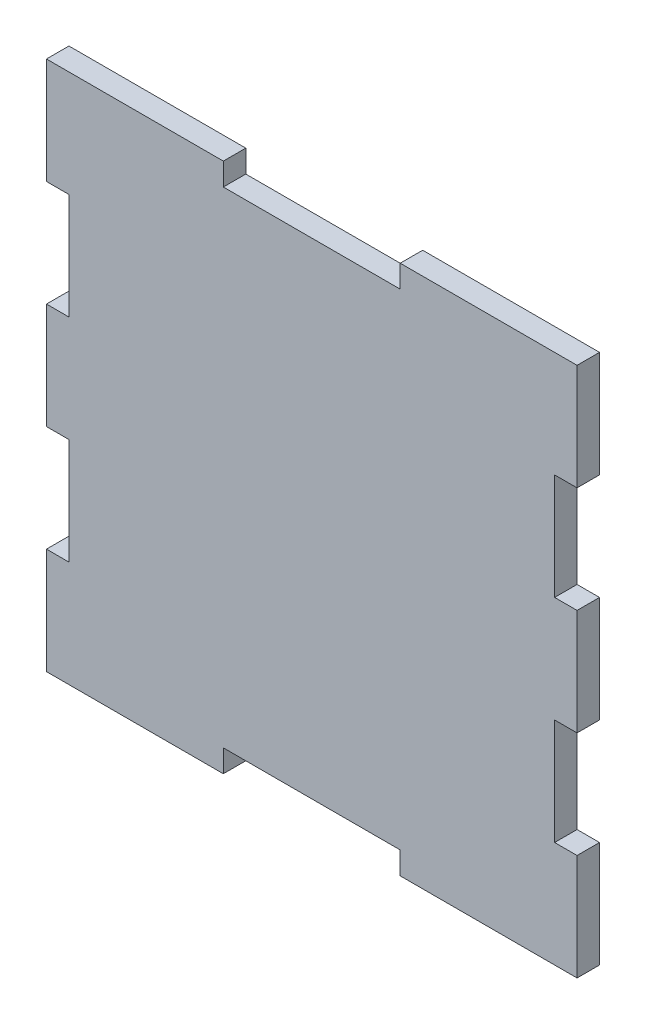
ISO-10303-21;
HEADER;
FILE_DESCRIPTION(('STEP AP214'),'2;1');
FILE_NAME('part.step','',(''),(''),'','','');
FILE_SCHEMA(('AUTOMOTIVE_DESIGN { 1 0 10303 214 1 1 1 1 }'));
ENDSEC;
DATA;
#1=APPLICATION_CONTEXT('core data for automotive mechanical design processes');
#2=APPLICATION_PROTOCOL_DEFINITION('international standard','automotive_design',2000,#1);
#3=PRODUCT_CONTEXT('',#1,'mechanical');
#4=PRODUCT('Part','Part','',(#3));
#5=PRODUCT_RELATED_PRODUCT_CATEGORY('part','',(#4));
#6=PRODUCT_DEFINITION_FORMATION('','',#4);
#7=PRODUCT_DEFINITION_CONTEXT('part definition',#1,'design');
#8=PRODUCT_DEFINITION('design','',#6,#7);
#9=PRODUCT_DEFINITION_SHAPE('','',#8);
#10=(LENGTH_UNIT() NAMED_UNIT(*) SI_UNIT(.MILLI.,.METRE.));
#11=(NAMED_UNIT(*) PLANE_ANGLE_UNIT() SI_UNIT($,.RADIAN.));
#12=(NAMED_UNIT(*) SI_UNIT($,.STERADIAN.) SOLID_ANGLE_UNIT());
#13=UNCERTAINTY_MEASURE_WITH_UNIT(LENGTH_MEASURE(1.E-05),#10,'distance_accuracy_value','');
#14=(GEOMETRIC_REPRESENTATION_CONTEXT(3) GLOBAL_UNCERTAINTY_ASSIGNED_CONTEXT((#13)) GLOBAL_UNIT_ASSIGNED_CONTEXT((#10,
#11,#12)) REPRESENTATION_CONTEXT('',''));
#15=CARTESIAN_POINT('',(0.,0.,0.));
#16=DIRECTION('',(0.,0.,1.));
#17=DIRECTION('',(1.,0.,0.));
#18=AXIS2_PLACEMENT_3D('',#15,#16,#17);
#19=CARTESIAN_POINT('',(-7.20562390158188,187.891798144197,6.35));
#20=DIRECTION('',(0.,-1.,0.));
#21=DIRECTION('',(1.,0.,0.));
#22=AXIS2_PLACEMENT_3D('',#19,#20,#21);
#23=PLANE('',#22);
#24=DIRECTION('',(-1.,0.,0.));
#25=VECTOR('',#24,1.);
#26=CARTESIAN_POINT('',(-7.20562390158188,187.891798144197,0.));
#27=LINE('',#26,#25);
#28=CARTESIAN_POINT('',(42.7943760984181,187.891798144198,0.));
#29=VERTEX_POINT('',#28);
#30=CARTESIAN_POINT('',(-7.20562390158188,187.891798144197,0.));
#31=VERTEX_POINT('',#30);
#32=EDGE_CURVE('E249',#29,#31,#27,.T.);
#33=ORIENTED_EDGE('',*,*,#32,.T.);
#34=DIRECTION('',(0.,0.,-1.));
#35=VECTOR('',#34,1.);
#36=CARTESIAN_POINT('',(-7.20562390158188,187.891798144197,6.35));
#37=LINE('',#36,#35);
#38=CARTESIAN_POINT('',(-7.20562390158188,187.891798144197,6.35));
#39=VERTEX_POINT('',#38);
#40=EDGE_CURVE('E11',#39,#31,#37,.T.);
#41=ORIENTED_EDGE('',*,*,#40,.F.);
#42=DIRECTION('',(-1.,0.,0.));
#43=VECTOR('',#42,1.);
#44=CARTESIAN_POINT('',(-7.20562390158188,187.891798144197,6.35));
#45=LINE('',#44,#43);
#46=CARTESIAN_POINT('',(42.7943760984181,187.891798144198,6.35));
#47=VERTEX_POINT('',#46);
#48=EDGE_CURVE('E303',#47,#39,#45,.T.);
#49=ORIENTED_EDGE('',*,*,#48,.F.);
#50=DIRECTION('',(0.,0.,-1.));
#51=VECTOR('',#50,1.);
#52=CARTESIAN_POINT('',(42.7943760984181,187.891798144198,6.35));
#53=LINE('',#52,#51);
#54=EDGE_CURVE('E245',#47,#29,#53,.T.);
#55=ORIENTED_EDGE('',*,*,#54,.T.);
#56=EDGE_LOOP('',(#33,#41,#49,#55));
#57=FACE_BOUND('',#56,.T.);
#58=ADVANCED_FACE('F33',(#57),#23,.F.);
#59=CARTESIAN_POINT('',(-7.20562390158188,187.891798144197,6.35));
#60=DIRECTION('',(1.,0.,0.));
#61=DIRECTION('',(0.,1.,0.));
#62=AXIS2_PLACEMENT_3D('',#59,#60,#61);
#63=PLANE('',#62);
#64=DIRECTION('',(0.,-1.,0.));
#65=VECTOR('',#64,1.);
#66=CARTESIAN_POINT('',(-7.20562390158188,187.891798144197,0.));
#67=LINE('',#66,#65);
#68=CARTESIAN_POINT('',(-7.20562390158181,157.891798144197,0.));
#69=VERTEX_POINT('',#68);
#70=EDGE_CURVE('E252',#31,#69,#67,.T.);
#71=ORIENTED_EDGE('',*,*,#70,.T.);
#72=DIRECTION('',(0.,0.,-1.));
#73=VECTOR('',#72,1.);
#74=CARTESIAN_POINT('',(-7.20562390158181,157.891798144197,6.35));
#75=LINE('',#74,#73);
#76=CARTESIAN_POINT('',(-7.20562390158181,157.891798144197,6.35));
#77=VERTEX_POINT('',#76);
#78=EDGE_CURVE('E41',#77,#69,#75,.T.);
#79=ORIENTED_EDGE('',*,*,#78,.F.);
#80=DIRECTION('',(0.,-1.,0.));
#81=VECTOR('',#80,1.);
#82=CARTESIAN_POINT('',(-7.20562390158188,187.891798144197,6.35));
#83=LINE('',#82,#81);
#84=EDGE_CURVE('E152',#39,#77,#83,.T.);
#85=ORIENTED_EDGE('',*,*,#84,.F.);
#86=ORIENTED_EDGE('',*,*,#40,.T.);
#87=EDGE_LOOP('',(#71,#79,#85,#86));
#88=FACE_BOUND('',#87,.T.);
#89=ADVANCED_FACE('F461',(#88),#63,.F.);
#90=CARTESIAN_POINT('',(-7.20562390158181,157.891798144197,6.35));
#91=DIRECTION('',(0.,1.,0.));
#92=DIRECTION('',(-1.,0.,0.));
#93=AXIS2_PLACEMENT_3D('',#90,#91,#92);
#94=PLANE('',#93);
#95=DIRECTION('',(1.,0.,0.));
#96=VECTOR('',#95,1.);
#97=CARTESIAN_POINT('',(-7.20562390158181,157.891798144197,0.));
#98=LINE('',#97,#96);
#99=CARTESIAN_POINT('',(-0.855623901581808,157.891798144197,0.));
#100=VERTEX_POINT('',#99);
#101=EDGE_CURVE('E254',#69,#100,#98,.T.);
#102=ORIENTED_EDGE('',*,*,#101,.T.);
#103=DIRECTION('',(0.,0.,-1.));
#104=VECTOR('',#103,1.);
#105=CARTESIAN_POINT('',(-0.855623901581808,157.891798144197,6.35));
#106=LINE('',#105,#104);
#107=CARTESIAN_POINT('',(-0.855623901581808,157.891798144197,6.35));
#108=VERTEX_POINT('',#107);
#109=EDGE_CURVE('E370',#108,#100,#106,.T.);
#110=ORIENTED_EDGE('',*,*,#109,.F.);
#111=DIRECTION('',(1.,0.,0.));
#112=VECTOR('',#111,1.);
#113=CARTESIAN_POINT('',(-7.20562390158181,157.891798144197,6.35));
#114=LINE('',#113,#112);
#115=EDGE_CURVE('E378',#77,#108,#114,.T.);
#116=ORIENTED_EDGE('',*,*,#115,.F.);
#117=ORIENTED_EDGE('',*,*,#78,.T.);
#118=EDGE_LOOP('',(#102,#110,#116,#117));
#119=FACE_BOUND('',#118,.T.);
#120=ADVANCED_FACE('F376',(#119),#94,.F.);
#121=CARTESIAN_POINT('',(-0.855623901581808,157.891798144197,6.35));
#122=DIRECTION('',(1.,0.,0.));
#123=DIRECTION('',(0.,1.,0.));
#124=AXIS2_PLACEMENT_3D('',#121,#122,#123);
#125=PLANE('',#124);
#126=DIRECTION('',(0.,-1.,0.));
#127=VECTOR('',#126,1.);
#128=CARTESIAN_POINT('',(-0.855623901581808,157.891798144197,0.));
#129=LINE('',#128,#127);
#130=CARTESIAN_POINT('',(-0.855623901581805,127.891798144197,0.));
#131=VERTEX_POINT('',#130);
#132=EDGE_CURVE('E256',#100,#131,#129,.T.);
#133=ORIENTED_EDGE('',*,*,#132,.T.);
#134=DIRECTION('',(0.,0.,-1.));
#135=VECTOR('',#134,1.);
#136=CARTESIAN_POINT('',(-0.855623901581805,127.891798144197,6.35));
#137=LINE('',#136,#135);
#138=CARTESIAN_POINT('',(-0.855623901581805,127.891798144197,6.35));
#139=VERTEX_POINT('',#138);
#140=EDGE_CURVE('E367',#139,#131,#137,.T.);
#141=ORIENTED_EDGE('',*,*,#140,.F.);
#142=DIRECTION('',(0.,-1.,0.));
#143=VECTOR('',#142,1.);
#144=CARTESIAN_POINT('',(-0.855623901581808,157.891798144197,6.35));
#145=LINE('',#144,#143);
#146=EDGE_CURVE('E396',#108,#139,#145,.T.);
#147=ORIENTED_EDGE('',*,*,#146,.F.);
#148=ORIENTED_EDGE('',*,*,#109,.T.);
#149=EDGE_LOOP('',(#133,#141,#147,#148));
#150=FACE_BOUND('',#149,.T.);
#151=ADVANCED_FACE('F387',(#150),#125,.F.);
#152=CARTESIAN_POINT('',(-0.855623901581805,127.891798144197,6.35));
#153=DIRECTION('',(0.,-1.,0.));
#154=DIRECTION('',(1.,0.,0.));
#155=AXIS2_PLACEMENT_3D('',#152,#153,#154);
#156=PLANE('',#155);
#157=DIRECTION('',(-1.,0.,0.));
#158=VECTOR('',#157,1.);
#159=CARTESIAN_POINT('',(-0.855623901581805,127.891798144197,0.));
#160=LINE('',#159,#158);
#161=CARTESIAN_POINT('',(-7.2056239015818,127.891798144197,0.));
#162=VERTEX_POINT('',#161);
#163=EDGE_CURVE('E258',#131,#162,#160,.T.);
#164=ORIENTED_EDGE('',*,*,#163,.T.);
#165=DIRECTION('',(0.,0.,-1.));
#166=VECTOR('',#165,1.);
#167=CARTESIAN_POINT('',(-7.2056239015818,127.891798144197,6.35));
#168=LINE('',#167,#166);
#169=CARTESIAN_POINT('',(-7.2056239015818,127.891798144197,6.35));
#170=VERTEX_POINT('',#169);
#171=EDGE_CURVE('E364',#170,#162,#168,.T.);
#172=ORIENTED_EDGE('',*,*,#171,.F.);
#173=DIRECTION('',(-1.,0.,0.));
#174=VECTOR('',#173,1.);
#175=CARTESIAN_POINT('',(-0.855623901581805,127.891798144197,6.35));
#176=LINE('',#175,#174);
#177=EDGE_CURVE('E393',#139,#170,#176,.T.);
#178=ORIENTED_EDGE('',*,*,#177,.F.);
#179=ORIENTED_EDGE('',*,*,#140,.T.);
#180=EDGE_LOOP('',(#164,#172,#178,#179));
#181=FACE_BOUND('',#180,.T.);
#182=ADVANCED_FACE('F391',(#181),#156,.F.);
#183=CARTESIAN_POINT('',(-7.2056239015818,127.891798144197,6.35));
#184=DIRECTION('',(1.,0.,0.));
#185=DIRECTION('',(0.,1.,0.));
#186=AXIS2_PLACEMENT_3D('',#183,#184,#185);
#187=PLANE('',#186);
#188=DIRECTION('',(0.,-1.,0.));
#189=VECTOR('',#188,1.);
#190=CARTESIAN_POINT('',(-7.2056239015818,127.891798144197,0.));
#191=LINE('',#190,#189);
#192=CARTESIAN_POINT('',(-7.20562390158172,97.8917981441975,0.));
#193=VERTEX_POINT('',#192);
#194=EDGE_CURVE('E260',#162,#193,#191,.T.);
#195=ORIENTED_EDGE('',*,*,#194,.T.);
#196=DIRECTION('',(0.,0.,-1.));
#197=VECTOR('',#196,1.);
#198=CARTESIAN_POINT('',(-7.20562390158172,97.8917981441975,6.35));
#199=LINE('',#198,#197);
#200=CARTESIAN_POINT('',(-7.20562390158172,97.8917981441975,6.35));
#201=VERTEX_POINT('',#200);
#202=EDGE_CURVE('E361',#201,#193,#199,.T.);
#203=ORIENTED_EDGE('',*,*,#202,.F.);
#204=DIRECTION('',(0.,-1.,0.));
#205=VECTOR('',#204,1.);
#206=CARTESIAN_POINT('',(-7.2056239015818,127.891798144197,6.35));
#207=LINE('',#206,#205);
#208=EDGE_CURVE('E395',#170,#201,#207,.T.);
#209=ORIENTED_EDGE('',*,*,#208,.F.);
#210=ORIENTED_EDGE('',*,*,#171,.T.);
#211=EDGE_LOOP('',(#195,#203,#209,#210));
#212=FACE_BOUND('',#211,.T.);
#213=ADVANCED_FACE('F474',(#212),#187,.F.);
#214=CARTESIAN_POINT('',(-7.20562390158172,97.8917981441975,6.35));
#215=DIRECTION('',(0.,1.,0.));
#216=DIRECTION('',(-1.,0.,0.));
#217=AXIS2_PLACEMENT_3D('',#214,#215,#216);
#218=PLANE('',#217);
#219=DIRECTION('',(1.,0.,0.));
#220=VECTOR('',#219,1.);
#221=CARTESIAN_POINT('',(-7.20562390158172,97.8917981441975,0.));
#222=LINE('',#221,#220);
#223=CARTESIAN_POINT('',(-0.855623901581715,97.8917981441975,0.));
#224=VERTEX_POINT('',#223);
#225=EDGE_CURVE('E262',#193,#224,#222,.T.);
#226=ORIENTED_EDGE('',*,*,#225,.T.);
#227=DIRECTION('',(0.,0.,-1.));
#228=VECTOR('',#227,1.);
#229=CARTESIAN_POINT('',(-0.855623901581715,97.8917981441975,6.35));
#230=LINE('',#229,#228);
#231=CARTESIAN_POINT('',(-0.855623901581715,97.8917981441975,6.35));
#232=VERTEX_POINT('',#231);
#233=EDGE_CURVE('E358',#232,#224,#230,.T.);
#234=ORIENTED_EDGE('',*,*,#233,.F.);
#235=DIRECTION('',(1.,0.,0.));
#236=VECTOR('',#235,1.);
#237=CARTESIAN_POINT('',(-7.20562390158172,97.8917981441975,6.35));
#238=LINE('',#237,#236);
#239=EDGE_CURVE('E398',#201,#232,#238,.T.);
#240=ORIENTED_EDGE('',*,*,#239,.F.);
#241=ORIENTED_EDGE('',*,*,#202,.T.);
#242=EDGE_LOOP('',(#226,#234,#240,#241));
#243=FACE_BOUND('',#242,.T.);
#244=ADVANCED_FACE('F477',(#243),#218,.F.);
#245=CARTESIAN_POINT('',(-0.855623901581715,97.8917981441975,6.35));
#246=DIRECTION('',(1.,0.,0.));
#247=DIRECTION('',(0.,1.,0.));
#248=AXIS2_PLACEMENT_3D('',#245,#246,#247);
#249=PLANE('',#248);
#250=DIRECTION('',(0.,-1.,0.));
#251=VECTOR('',#250,1.);
#252=CARTESIAN_POINT('',(-0.855623901581715,97.8917981441975,0.));
#253=LINE('',#252,#251);
#254=CARTESIAN_POINT('',(-0.855623901581712,67.8917981441975,0.));
#255=VERTEX_POINT('',#254);
#256=EDGE_CURVE('E264',#224,#255,#253,.T.);
#257=ORIENTED_EDGE('',*,*,#256,.T.);
#258=DIRECTION('',(0.,0.,-1.));
#259=VECTOR('',#258,1.);
#260=CARTESIAN_POINT('',(-0.855623901581712,67.8917981441975,6.35));
#261=LINE('',#260,#259);
#262=CARTESIAN_POINT('',(-0.855623901581712,67.8917981441975,6.35));
#263=VERTEX_POINT('',#262);
#264=EDGE_CURVE('E355',#263,#255,#261,.T.);
#265=ORIENTED_EDGE('',*,*,#264,.F.);
#266=DIRECTION('',(0.,-1.,0.));
#267=VECTOR('',#266,1.);
#268=CARTESIAN_POINT('',(-0.855623901581715,97.8917981441975,6.35));
#269=LINE('',#268,#267);
#270=EDGE_CURVE('E404',#232,#263,#269,.T.);
#271=ORIENTED_EDGE('',*,*,#270,.F.);
#272=ORIENTED_EDGE('',*,*,#233,.T.);
#273=EDGE_LOOP('',(#257,#265,#271,#272));
#274=FACE_BOUND('',#273,.T.);
#275=ADVANCED_FACE('F481',(#274),#249,.F.);
#276=CARTESIAN_POINT('',(-0.855623901581712,67.8917981441975,6.35));
#277=DIRECTION('',(0.,-1.,0.));
#278=DIRECTION('',(1.,0.,0.));
#279=AXIS2_PLACEMENT_3D('',#276,#277,#278);
#280=PLANE('',#279);
#281=DIRECTION('',(-1.,0.,0.));
#282=VECTOR('',#281,1.);
#283=CARTESIAN_POINT('',(-0.855623901581712,67.8917981441975,0.));
#284=LINE('',#283,#282);
#285=CARTESIAN_POINT('',(-7.20562390158172,67.8917981441974,0.));
#286=VERTEX_POINT('',#285);
#287=EDGE_CURVE('E266',#255,#286,#284,.T.);
#288=ORIENTED_EDGE('',*,*,#287,.T.);
#289=DIRECTION('',(0.,0.,-1.));
#290=VECTOR('',#289,1.);
#291=CARTESIAN_POINT('',(-7.20562390158172,67.8917981441974,6.35));
#292=LINE('',#291,#290);
#293=CARTESIAN_POINT('',(-7.20562390158172,67.8917981441974,6.35));
#294=VERTEX_POINT('',#293);
#295=EDGE_CURVE('E352',#294,#286,#292,.T.);
#296=ORIENTED_EDGE('',*,*,#295,.F.);
#297=DIRECTION('',(-1.,0.,0.));
#298=VECTOR('',#297,1.);
#299=CARTESIAN_POINT('',(-0.855623901581712,67.8917981441975,6.35));
#300=LINE('',#299,#298);
#301=EDGE_CURVE('E406',#263,#294,#300,.T.);
#302=ORIENTED_EDGE('',*,*,#301,.F.);
#303=ORIENTED_EDGE('',*,*,#264,.T.);
#304=EDGE_LOOP('',(#288,#296,#302,#303));
#305=FACE_BOUND('',#304,.T.);
#306=ADVANCED_FACE('F485',(#305),#280,.F.);
#307=CARTESIAN_POINT('',(-7.20562390158172,67.8917981441974,6.35));
#308=DIRECTION('',(1.,0.,0.));
#309=DIRECTION('',(0.,1.,0.));
#310=AXIS2_PLACEMENT_3D('',#307,#308,#309);
#311=PLANE('',#310);
#312=DIRECTION('',(0.,-1.,0.));
#313=VECTOR('',#312,1.);
#314=CARTESIAN_POINT('',(-7.20562390158172,67.8917981441974,0.));
#315=LINE('',#314,#313);
#316=CARTESIAN_POINT('',(-7.20562390158171,37.8917981441974,0.));
#317=VERTEX_POINT('',#316);
#318=EDGE_CURVE('E268',#286,#317,#315,.T.);
#319=ORIENTED_EDGE('',*,*,#318,.T.);
#320=DIRECTION('',(0.,0.,-1.));
#321=VECTOR('',#320,1.);
#322=CARTESIAN_POINT('',(-7.20562390158171,37.8917981441974,6.35));
#323=LINE('',#322,#321);
#324=CARTESIAN_POINT('',(-7.20562390158171,37.8917981441974,6.35));
#325=VERTEX_POINT('',#324);
#326=EDGE_CURVE('E349',#325,#317,#323,.T.);
#327=ORIENTED_EDGE('',*,*,#326,.F.);
#328=DIRECTION('',(0.,-1.,0.));
#329=VECTOR('',#328,1.);
#330=CARTESIAN_POINT('',(-7.20562390158172,67.8917981441974,6.35));
#331=LINE('',#330,#329);
#332=EDGE_CURVE('E408',#294,#325,#331,.T.);
#333=ORIENTED_EDGE('',*,*,#332,.F.);
#334=ORIENTED_EDGE('',*,*,#295,.T.);
#335=EDGE_LOOP('',(#319,#327,#333,#334));
#336=FACE_BOUND('',#335,.T.);
#337=ADVANCED_FACE('F489',(#336),#311,.F.);
#338=CARTESIAN_POINT('',(-7.20562390158171,37.8917981441974,6.35));
#339=DIRECTION('',(0.,1.,0.));
#340=DIRECTION('',(0.,0.,1.));
#341=AXIS2_PLACEMENT_3D('',#338,#339,#340);
#342=PLANE('',#341);
#343=DIRECTION('',(1.,0.,0.));
#344=VECTOR('',#343,1.);
#345=CARTESIAN_POINT('',(-7.20562390158171,37.8917981441974,0.));
#346=LINE('',#345,#344);
#347=CARTESIAN_POINT('',(42.7943760984182,37.8917981441974,0.));
#348=VERTEX_POINT('',#347);
#349=EDGE_CURVE('E270',#317,#348,#346,.T.);
#350=ORIENTED_EDGE('',*,*,#349,.T.);
#351=DIRECTION('',(0.,0.,-1.));
#352=VECTOR('',#351,1.);
#353=CARTESIAN_POINT('',(42.7943760984182,37.8917981441974,6.35));
#354=LINE('',#353,#352);
#355=CARTESIAN_POINT('',(42.7943760984182,37.8917981441974,6.35));
#356=VERTEX_POINT('',#355);
#357=EDGE_CURVE('E346',#356,#348,#354,.T.);
#358=ORIENTED_EDGE('',*,*,#357,.F.);
#359=DIRECTION('',(1.,0.,0.));
#360=VECTOR('',#359,1.);
#361=CARTESIAN_POINT('',(-7.20562390158171,37.8917981441974,6.35));
#362=LINE('',#361,#360);
#363=EDGE_CURVE('E410',#325,#356,#362,.T.);
#364=ORIENTED_EDGE('',*,*,#363,.F.);
#365=ORIENTED_EDGE('',*,*,#326,.T.);
#366=EDGE_LOOP('',(#350,#358,#364,#365));
#367=FACE_BOUND('',#366,.T.);
#368=ADVANCED_FACE('F493',(#367),#342,.F.);
#369=CARTESIAN_POINT('',(42.7943760984182,37.8917981441974,6.35));
#370=DIRECTION('',(-1.,0.,0.));
#371=DIRECTION('',(0.,0.,1.));
#372=AXIS2_PLACEMENT_3D('',#369,#370,#371);
#373=PLANE('',#372);
#374=DIRECTION('',(0.,1.,0.));
#375=VECTOR('',#374,1.);
#376=CARTESIAN_POINT('',(42.7943760984182,37.8917981441974,0.));
#377=LINE('',#376,#375);
#378=CARTESIAN_POINT('',(42.7943760984182,44.2417981441974,0.));
#379=VERTEX_POINT('',#378);
#380=EDGE_CURVE('E272',#348,#379,#377,.T.);
#381=ORIENTED_EDGE('',*,*,#380,.T.);
#382=DIRECTION('',(0.,0.,-1.));
#383=VECTOR('',#382,1.);
#384=CARTESIAN_POINT('',(42.7943760984182,44.2417981441974,6.35));
#385=LINE('',#384,#383);
#386=CARTESIAN_POINT('',(42.7943760984182,44.2417981441974,6.35));
#387=VERTEX_POINT('',#386);
#388=EDGE_CURVE('E343',#387,#379,#385,.T.);
#389=ORIENTED_EDGE('',*,*,#388,.F.);
#390=DIRECTION('',(0.,1.,0.));
#391=VECTOR('',#390,1.);
#392=CARTESIAN_POINT('',(42.7943760984182,37.8917981441974,6.35));
#393=LINE('',#392,#391);
#394=EDGE_CURVE('E412',#356,#387,#393,.T.);
#395=ORIENTED_EDGE('',*,*,#394,.F.);
#396=ORIENTED_EDGE('',*,*,#357,.T.);
#397=EDGE_LOOP('',(#381,#389,#395,#396));
#398=FACE_BOUND('',#397,.T.);
#399=ADVANCED_FACE('F497',(#398),#373,.F.);
#400=CARTESIAN_POINT('',(42.7943760984182,44.2417981441974,6.35));
#401=DIRECTION('',(0.,1.,0.));
#402=DIRECTION('',(0.,0.,1.));
#403=AXIS2_PLACEMENT_3D('',#400,#401,#402);
#404=PLANE('',#403);
#405=DIRECTION('',(1.,0.,0.));
#406=VECTOR('',#405,1.);
#407=CARTESIAN_POINT('',(42.7943760984182,44.2417981441974,0.));
#408=LINE('',#407,#406);
#409=CARTESIAN_POINT('',(92.7943760984182,44.2417981441974,0.));
#410=VERTEX_POINT('',#409);
#411=EDGE_CURVE('E274',#379,#410,#408,.T.);
#412=ORIENTED_EDGE('',*,*,#411,.T.);
#413=DIRECTION('',(0.,0.,-1.));
#414=VECTOR('',#413,1.);
#415=CARTESIAN_POINT('',(92.7943760984182,44.2417981441974,6.35));
#416=LINE('',#415,#414);
#417=CARTESIAN_POINT('',(92.7943760984182,44.2417981441974,6.35));
#418=VERTEX_POINT('',#417);
#419=EDGE_CURVE('E340',#418,#410,#416,.T.);
#420=ORIENTED_EDGE('',*,*,#419,.F.);
#421=DIRECTION('',(1.,0.,0.));
#422=VECTOR('',#421,1.);
#423=CARTESIAN_POINT('',(42.7943760984182,44.2417981441974,6.35));
#424=LINE('',#423,#422);
#425=EDGE_CURVE('E414',#387,#418,#424,.T.);
#426=ORIENTED_EDGE('',*,*,#425,.F.);
#427=ORIENTED_EDGE('',*,*,#388,.T.);
#428=EDGE_LOOP('',(#412,#420,#426,#427));
#429=FACE_BOUND('',#428,.T.);
#430=ADVANCED_FACE('F501',(#429),#404,.F.);
#431=CARTESIAN_POINT('',(92.7943760984182,44.2417981441974,6.35));
#432=DIRECTION('',(1.,0.,0.));
#433=DIRECTION('',(0.,0.,-1.));
#434=AXIS2_PLACEMENT_3D('',#431,#432,#433);
#435=PLANE('',#434);
#436=DIRECTION('',(0.,-1.,0.));
#437=VECTOR('',#436,1.);
#438=CARTESIAN_POINT('',(92.7943760984182,44.2417981441974,0.));
#439=LINE('',#438,#437);
#440=CARTESIAN_POINT('',(92.7943760984182,37.8917981441974,0.));
#441=VERTEX_POINT('',#440);
#442=EDGE_CURVE('E276',#410,#441,#439,.T.);
#443=ORIENTED_EDGE('',*,*,#442,.T.);
#444=DIRECTION('',(0.,0.,-1.));
#445=VECTOR('',#444,1.);
#446=CARTESIAN_POINT('',(92.7943760984182,37.8917981441974,6.35));
#447=LINE('',#446,#445);
#448=CARTESIAN_POINT('',(92.7943760984182,37.8917981441974,6.35));
#449=VERTEX_POINT('',#448);
#450=EDGE_CURVE('E337',#449,#441,#447,.T.);
#451=ORIENTED_EDGE('',*,*,#450,.F.);
#452=DIRECTION('',(0.,-1.,0.));
#453=VECTOR('',#452,1.);
#454=CARTESIAN_POINT('',(92.7943760984182,44.2417981441974,6.35));
#455=LINE('',#454,#453);
#456=EDGE_CURVE('E416',#418,#449,#455,.T.);
#457=ORIENTED_EDGE('',*,*,#456,.F.);
#458=ORIENTED_EDGE('',*,*,#419,.T.);
#459=EDGE_LOOP('',(#443,#451,#457,#458));
#460=FACE_BOUND('',#459,.T.);
#461=ADVANCED_FACE('F505',(#460),#435,.F.);
#462=CARTESIAN_POINT('',(92.7943760984182,37.8917981441974,6.35));
#463=DIRECTION('',(0.,1.,0.));
#464=DIRECTION('',(0.,0.,1.));
#465=AXIS2_PLACEMENT_3D('',#462,#463,#464);
#466=PLANE('',#465);
#467=DIRECTION('',(1.,0.,0.));
#468=VECTOR('',#467,1.);
#469=CARTESIAN_POINT('',(92.7943760984182,37.8917981441974,0.));
#470=LINE('',#469,#468);
#471=CARTESIAN_POINT('',(142.794376098418,37.8917981441974,0.));
#472=VERTEX_POINT('',#471);
#473=EDGE_CURVE('E278',#441,#472,#470,.T.);
#474=ORIENTED_EDGE('',*,*,#473,.T.);
#475=DIRECTION('',(0.,0.,-1.));
#476=VECTOR('',#475,1.);
#477=CARTESIAN_POINT('',(142.794376098418,37.8917981441974,6.35));
#478=LINE('',#477,#476);
#479=CARTESIAN_POINT('',(142.794376098418,37.8917981441974,6.35));
#480=VERTEX_POINT('',#479);
#481=EDGE_CURVE('E334',#480,#472,#478,.T.);
#482=ORIENTED_EDGE('',*,*,#481,.F.);
#483=DIRECTION('',(1.,0.,0.));
#484=VECTOR('',#483,1.);
#485=CARTESIAN_POINT('',(92.7943760984182,37.8917981441974,6.35));
#486=LINE('',#485,#484);
#487=EDGE_CURVE('E418',#449,#480,#486,.T.);
#488=ORIENTED_EDGE('',*,*,#487,.F.);
#489=ORIENTED_EDGE('',*,*,#450,.T.);
#490=EDGE_LOOP('',(#474,#482,#488,#489));
#491=FACE_BOUND('',#490,.T.);
#492=ADVANCED_FACE('F509',(#491),#466,.F.);
#493=CARTESIAN_POINT('',(142.794376098418,67.8917981441974,6.35));
#494=DIRECTION('',(-1.,0.,0.));
#495=DIRECTION('',(0.,-1.,0.));
#496=AXIS2_PLACEMENT_3D('',#493,#494,#495);
#497=PLANE('',#496);
#498=DIRECTION('',(0.,1.,0.));
#499=VECTOR('',#498,1.);
#500=CARTESIAN_POINT('',(142.794376098418,67.8917981441974,0.));
#501=LINE('',#500,#499);
#502=CARTESIAN_POINT('',(142.794376098418,67.8917981441974,0.));
#503=VERTEX_POINT('',#502);
#504=EDGE_CURVE('E280',#472,#503,#501,.T.);
#505=ORIENTED_EDGE('',*,*,#504,.T.);
#506=DIRECTION('',(0.,0.,-1.));
#507=VECTOR('',#506,1.);
#508=CARTESIAN_POINT('',(142.794376098418,67.8917981441974,6.35));
#509=LINE('',#508,#507);
#510=CARTESIAN_POINT('',(142.794376098418,67.8917981441974,6.35));
#511=VERTEX_POINT('',#510);
#512=EDGE_CURVE('E331',#511,#503,#509,.T.);
#513=ORIENTED_EDGE('',*,*,#512,.F.);
#514=DIRECTION('',(0.,1.,0.));
#515=VECTOR('',#514,1.);
#516=CARTESIAN_POINT('',(142.794376098418,67.8917981441974,6.35));
#517=LINE('',#516,#515);
#518=EDGE_CURVE('E420',#480,#511,#517,.T.);
#519=ORIENTED_EDGE('',*,*,#518,.F.);
#520=ORIENTED_EDGE('',*,*,#481,.T.);
#521=EDGE_LOOP('',(#505,#513,#519,#520));
#522=FACE_BOUND('',#521,.T.);
#523=ADVANCED_FACE('F513',(#522),#497,.F.);
#524=CARTESIAN_POINT('',(136.444376098418,67.8917981441974,6.35));
#525=DIRECTION('',(0.,-1.,0.));
#526=DIRECTION('',(0.,0.,-1.));
#527=AXIS2_PLACEMENT_3D('',#524,#525,#526);
#528=PLANE('',#527);
#529=DIRECTION('',(-1.,0.,0.));
#530=VECTOR('',#529,1.);
#531=CARTESIAN_POINT('',(136.444376098418,67.8917981441974,0.));
#532=LINE('',#531,#530);
#533=CARTESIAN_POINT('',(136.444376098418,67.8917981441974,0.));
#534=VERTEX_POINT('',#533);
#535=EDGE_CURVE('E282',#503,#534,#532,.T.);
#536=ORIENTED_EDGE('',*,*,#535,.T.);
#537=DIRECTION('',(0.,0.,-1.));
#538=VECTOR('',#537,1.);
#539=CARTESIAN_POINT('',(136.444376098418,67.8917981441974,6.35));
#540=LINE('',#539,#538);
#541=CARTESIAN_POINT('',(136.444376098418,67.8917981441974,6.35));
#542=VERTEX_POINT('',#541);
#543=EDGE_CURVE('E328',#542,#534,#540,.T.);
#544=ORIENTED_EDGE('',*,*,#543,.F.);
#545=DIRECTION('',(-1.,0.,0.));
#546=VECTOR('',#545,1.);
#547=CARTESIAN_POINT('',(136.444376098418,67.8917981441974,6.35));
#548=LINE('',#547,#546);
#549=EDGE_CURVE('E422',#511,#542,#548,.T.);
#550=ORIENTED_EDGE('',*,*,#549,.F.);
#551=ORIENTED_EDGE('',*,*,#512,.T.);
#552=EDGE_LOOP('',(#536,#544,#550,#551));
#553=FACE_BOUND('',#552,.T.);
#554=ADVANCED_FACE('F517',(#553),#528,.F.);
#555=CARTESIAN_POINT('',(136.444376098418,97.8917981441974,6.35));
#556=DIRECTION('',(-1.,0.,0.));
#557=DIRECTION('',(0.,0.,1.));
#558=AXIS2_PLACEMENT_3D('',#555,#556,#557);
#559=PLANE('',#558);
#560=DIRECTION('',(0.,1.,0.));
#561=VECTOR('',#560,1.);
#562=CARTESIAN_POINT('',(136.444376098418,97.8917981441974,0.));
#563=LINE('',#562,#561);
#564=CARTESIAN_POINT('',(136.444376098418,97.8917981441974,0.));
#565=VERTEX_POINT('',#564);
#566=EDGE_CURVE('E284',#534,#565,#563,.T.);
#567=ORIENTED_EDGE('',*,*,#566,.T.);
#568=DIRECTION('',(0.,0.,-1.));
#569=VECTOR('',#568,1.);
#570=CARTESIAN_POINT('',(136.444376098418,97.8917981441974,6.35));
#571=LINE('',#570,#569);
#572=CARTESIAN_POINT('',(136.444376098418,97.8917981441974,6.35));
#573=VERTEX_POINT('',#572);
#574=EDGE_CURVE('E325',#573,#565,#571,.T.);
#575=ORIENTED_EDGE('',*,*,#574,.F.);
#576=DIRECTION('',(0.,1.,0.));
#577=VECTOR('',#576,1.);
#578=CARTESIAN_POINT('',(136.444376098418,97.8917981441974,6.35));
#579=LINE('',#578,#577);
#580=EDGE_CURVE('E424',#542,#573,#579,.T.);
#581=ORIENTED_EDGE('',*,*,#580,.F.);
#582=ORIENTED_EDGE('',*,*,#543,.T.);
#583=EDGE_LOOP('',(#567,#575,#581,#582));
#584=FACE_BOUND('',#583,.T.);
#585=ADVANCED_FACE('F521',(#584),#559,.F.);
#586=CARTESIAN_POINT('',(142.794376098418,97.8917981441974,6.35));
#587=DIRECTION('',(0.,1.,0.));
#588=DIRECTION('',(0.,0.,1.));
#589=AXIS2_PLACEMENT_3D('',#586,#587,#588);
#590=PLANE('',#589);
#591=DIRECTION('',(1.,0.,0.));
#592=VECTOR('',#591,1.);
#593=CARTESIAN_POINT('',(142.794376098418,97.8917981441974,0.));
#594=LINE('',#593,#592);
#595=CARTESIAN_POINT('',(142.794376098418,97.8917981441974,0.));
#596=VERTEX_POINT('',#595);
#597=EDGE_CURVE('E286',#565,#596,#594,.T.);
#598=ORIENTED_EDGE('',*,*,#597,.T.);
#599=DIRECTION('',(0.,0.,-1.));
#600=VECTOR('',#599,1.);
#601=CARTESIAN_POINT('',(142.794376098418,97.8917981441974,6.35));
#602=LINE('',#601,#600);
#603=CARTESIAN_POINT('',(142.794376098418,97.8917981441974,6.35));
#604=VERTEX_POINT('',#603);
#605=EDGE_CURVE('E322',#604,#596,#602,.T.);
#606=ORIENTED_EDGE('',*,*,#605,.F.);
#607=DIRECTION('',(1.,0.,0.));
#608=VECTOR('',#607,1.);
#609=CARTESIAN_POINT('',(142.794376098418,97.8917981441974,6.35));
#610=LINE('',#609,#608);
#611=EDGE_CURVE('E426',#573,#604,#610,.T.);
#612=ORIENTED_EDGE('',*,*,#611,.F.);
#613=ORIENTED_EDGE('',*,*,#574,.T.);
#614=EDGE_LOOP('',(#598,#606,#612,#613));
#615=FACE_BOUND('',#614,.T.);
#616=ADVANCED_FACE('F525',(#615),#590,.F.);
#617=CARTESIAN_POINT('',(142.794376098418,127.891798144197,6.35));
#618=DIRECTION('',(-1.,0.,0.));
#619=DIRECTION('',(0.,0.,1.));
#620=AXIS2_PLACEMENT_3D('',#617,#618,#619);
#621=PLANE('',#620);
#622=DIRECTION('',(0.,1.,0.));
#623=VECTOR('',#622,1.);
#624=CARTESIAN_POINT('',(142.794376098418,127.891798144197,0.));
#625=LINE('',#624,#623);
#626=CARTESIAN_POINT('',(142.794376098418,127.891798144197,0.));
#627=VERTEX_POINT('',#626);
#628=EDGE_CURVE('E288',#596,#627,#625,.T.);
#629=ORIENTED_EDGE('',*,*,#628,.T.);
#630=DIRECTION('',(0.,0.,-1.));
#631=VECTOR('',#630,1.);
#632=CARTESIAN_POINT('',(142.794376098418,127.891798144197,6.35));
#633=LINE('',#632,#631);
#634=CARTESIAN_POINT('',(142.794376098418,127.891798144197,6.35));
#635=VERTEX_POINT('',#634);
#636=EDGE_CURVE('E319',#635,#627,#633,.T.);
#637=ORIENTED_EDGE('',*,*,#636,.F.);
#638=DIRECTION('',(0.,1.,0.));
#639=VECTOR('',#638,1.);
#640=CARTESIAN_POINT('',(142.794376098418,127.891798144197,6.35));
#641=LINE('',#640,#639);
#642=EDGE_CURVE('E428',#604,#635,#641,.T.);
#643=ORIENTED_EDGE('',*,*,#642,.F.);
#644=ORIENTED_EDGE('',*,*,#605,.T.);
#645=EDGE_LOOP('',(#629,#637,#643,#644));
#646=FACE_BOUND('',#645,.T.);
#647=ADVANCED_FACE('F529',(#646),#621,.F.);
#648=CARTESIAN_POINT('',(136.444376098418,127.891798144197,6.35));
#649=DIRECTION('',(0.,-1.,0.));
#650=DIRECTION('',(0.,0.,-1.));
#651=AXIS2_PLACEMENT_3D('',#648,#649,#650);
#652=PLANE('',#651);
#653=DIRECTION('',(-1.,0.,0.));
#654=VECTOR('',#653,1.);
#655=CARTESIAN_POINT('',(136.444376098418,127.891798144197,0.));
#656=LINE('',#655,#654);
#657=CARTESIAN_POINT('',(136.444376098418,127.891798144197,0.));
#658=VERTEX_POINT('',#657);
#659=EDGE_CURVE('E290',#627,#658,#656,.T.);
#660=ORIENTED_EDGE('',*,*,#659,.T.);
#661=DIRECTION('',(0.,0.,-1.));
#662=VECTOR('',#661,1.);
#663=CARTESIAN_POINT('',(136.444376098418,127.891798144197,6.35));
#664=LINE('',#663,#662);
#665=CARTESIAN_POINT('',(136.444376098418,127.891798144197,6.35));
#666=VERTEX_POINT('',#665);
#667=EDGE_CURVE('E316',#666,#658,#664,.T.);
#668=ORIENTED_EDGE('',*,*,#667,.F.);
#669=DIRECTION('',(-1.,0.,0.));
#670=VECTOR('',#669,1.);
#671=CARTESIAN_POINT('',(136.444376098418,127.891798144197,6.35));
#672=LINE('',#671,#670);
#673=EDGE_CURVE('E430',#635,#666,#672,.T.);
#674=ORIENTED_EDGE('',*,*,#673,.F.);
#675=ORIENTED_EDGE('',*,*,#636,.T.);
#676=EDGE_LOOP('',(#660,#668,#674,#675));
#677=FACE_BOUND('',#676,.T.);
#678=ADVANCED_FACE('F533',(#677),#652,.F.);
#679=CARTESIAN_POINT('',(136.444376098418,157.891798144197,6.35));
#680=DIRECTION('',(-1.,0.,0.));
#681=DIRECTION('',(0.,0.,1.));
#682=AXIS2_PLACEMENT_3D('',#679,#680,#681);
#683=PLANE('',#682);
#684=DIRECTION('',(0.,1.,0.));
#685=VECTOR('',#684,1.);
#686=CARTESIAN_POINT('',(136.444376098418,157.891798144197,0.));
#687=LINE('',#686,#685);
#688=CARTESIAN_POINT('',(136.444376098418,157.891798144197,0.));
#689=VERTEX_POINT('',#688);
#690=EDGE_CURVE('E292',#658,#689,#687,.T.);
#691=ORIENTED_EDGE('',*,*,#690,.T.);
#692=DIRECTION('',(0.,0.,-1.));
#693=VECTOR('',#692,1.);
#694=CARTESIAN_POINT('',(136.444376098418,157.891798144197,6.35));
#695=LINE('',#694,#693);
#696=CARTESIAN_POINT('',(136.444376098418,157.891798144197,6.35));
#697=VERTEX_POINT('',#696);
#698=EDGE_CURVE('E313',#697,#689,#695,.T.);
#699=ORIENTED_EDGE('',*,*,#698,.F.);
#700=DIRECTION('',(0.,1.,0.));
#701=VECTOR('',#700,1.);
#702=CARTESIAN_POINT('',(136.444376098418,157.891798144197,6.35));
#703=LINE('',#702,#701);
#704=EDGE_CURVE('E432',#666,#697,#703,.T.);
#705=ORIENTED_EDGE('',*,*,#704,.F.);
#706=ORIENTED_EDGE('',*,*,#667,.T.);
#707=EDGE_LOOP('',(#691,#699,#705,#706));
#708=FACE_BOUND('',#707,.T.);
#709=ADVANCED_FACE('F537',(#708),#683,.F.);
#710=CARTESIAN_POINT('',(142.794376098418,157.891798144197,6.35));
#711=DIRECTION('',(0.,1.,0.));
#712=DIRECTION('',(0.,0.,1.));
#713=AXIS2_PLACEMENT_3D('',#710,#711,#712);
#714=PLANE('',#713);
#715=DIRECTION('',(1.,0.,0.));
#716=VECTOR('',#715,1.);
#717=CARTESIAN_POINT('',(142.794376098418,157.891798144197,0.));
#718=LINE('',#717,#716);
#719=CARTESIAN_POINT('',(142.794376098418,157.891798144197,0.));
#720=VERTEX_POINT('',#719);
#721=EDGE_CURVE('E294',#689,#720,#718,.T.);
#722=ORIENTED_EDGE('',*,*,#721,.T.);
#723=DIRECTION('',(0.,0.,-1.));
#724=VECTOR('',#723,1.);
#725=CARTESIAN_POINT('',(142.794376098418,157.891798144197,6.35));
#726=LINE('',#725,#724);
#727=CARTESIAN_POINT('',(142.794376098418,157.891798144197,6.35));
#728=VERTEX_POINT('',#727);
#729=EDGE_CURVE('E310',#728,#720,#726,.T.);
#730=ORIENTED_EDGE('',*,*,#729,.F.);
#731=DIRECTION('',(1.,0.,0.));
#732=VECTOR('',#731,1.);
#733=CARTESIAN_POINT('',(142.794376098418,157.891798144197,6.35));
#734=LINE('',#733,#732);
#735=EDGE_CURVE('E434',#697,#728,#734,.T.);
#736=ORIENTED_EDGE('',*,*,#735,.F.);
#737=ORIENTED_EDGE('',*,*,#698,.T.);
#738=EDGE_LOOP('',(#722,#730,#736,#737));
#739=FACE_BOUND('',#738,.T.);
#740=ADVANCED_FACE('F541',(#739),#714,.F.);
#741=CARTESIAN_POINT('',(142.794376098418,187.891798144197,6.35));
#742=DIRECTION('',(-1.,0.,0.));
#743=DIRECTION('',(0.,-1.,0.));
#744=AXIS2_PLACEMENT_3D('',#741,#742,#743);
#745=PLANE('',#744);
#746=DIRECTION('',(0.,1.,0.));
#747=VECTOR('',#746,1.);
#748=CARTESIAN_POINT('',(142.794376098418,187.891798144197,0.));
#749=LINE('',#748,#747);
#750=CARTESIAN_POINT('',(142.794376098418,187.891798144197,0.));
#751=VERTEX_POINT('',#750);
#752=EDGE_CURVE('E296',#720,#751,#749,.T.);
#753=ORIENTED_EDGE('',*,*,#752,.T.);
#754=DIRECTION('',(0.,0.,-1.));
#755=VECTOR('',#754,1.);
#756=CARTESIAN_POINT('',(142.794376098418,187.891798144197,6.35));
#757=LINE('',#756,#755);
#758=CARTESIAN_POINT('',(142.794376098418,187.891798144197,6.35));
#759=VERTEX_POINT('',#758);
#760=EDGE_CURVE('E307',#759,#751,#757,.T.);
#761=ORIENTED_EDGE('',*,*,#760,.F.);
#762=DIRECTION('',(0.,1.,0.));
#763=VECTOR('',#762,1.);
#764=CARTESIAN_POINT('',(142.794376098418,187.891798144197,6.35));
#765=LINE('',#764,#763);
#766=EDGE_CURVE('E436',#728,#759,#765,.T.);
#767=ORIENTED_EDGE('',*,*,#766,.F.);
#768=ORIENTED_EDGE('',*,*,#729,.T.);
#769=EDGE_LOOP('',(#753,#761,#767,#768));
#770=FACE_BOUND('',#769,.T.);
#771=ADVANCED_FACE('F442',(#770),#745,.F.);
#772=CARTESIAN_POINT('',(92.7943760984182,187.891798144197,6.35));
#773=DIRECTION('',(0.,-1.,0.));
#774=DIRECTION('',(0.,0.,-1.));
#775=AXIS2_PLACEMENT_3D('',#772,#773,#774);
#776=PLANE('',#775);
#777=DIRECTION('',(-1.,0.,0.));
#778=VECTOR('',#777,1.);
#779=CARTESIAN_POINT('',(92.7943760984182,187.891798144197,0.));
#780=LINE('',#779,#778);
#781=CARTESIAN_POINT('',(92.7943760984182,187.891798144197,0.));
#782=VERTEX_POINT('',#781);
#783=EDGE_CURVE('E298',#751,#782,#780,.T.);
#784=ORIENTED_EDGE('',*,*,#783,.T.);
#785=DIRECTION('',(0.,0.,-1.));
#786=VECTOR('',#785,1.);
#787=CARTESIAN_POINT('',(92.7943760984182,187.891798144197,6.35));
#788=LINE('',#787,#786);
#789=CARTESIAN_POINT('',(92.7943760984182,187.891798144197,6.35));
#790=VERTEX_POINT('',#789);
#791=EDGE_CURVE('E240',#790,#782,#788,.T.);
#792=ORIENTED_EDGE('',*,*,#791,.F.);
#793=DIRECTION('',(-1.,0.,0.));
#794=VECTOR('',#793,1.);
#795=CARTESIAN_POINT('',(92.7943760984182,187.891798144197,6.35));
#796=LINE('',#795,#794);
#797=EDGE_CURVE('E231',#759,#790,#796,.T.);
#798=ORIENTED_EDGE('',*,*,#797,.F.);
#799=ORIENTED_EDGE('',*,*,#760,.T.);
#800=EDGE_LOOP('',(#784,#792,#798,#799));
#801=FACE_BOUND('',#800,.T.);
#802=ADVANCED_FACE('F446',(#801),#776,.F.);
#803=CARTESIAN_POINT('',(92.7943760984182,181.541798144197,6.35));
#804=DIRECTION('',(1.,0.,0.));
#805=DIRECTION('',(0.,0.,-1.));
#806=AXIS2_PLACEMENT_3D('',#803,#804,#805);
#807=PLANE('',#806);
#808=DIRECTION('',(0.,-1.,0.));
#809=VECTOR('',#808,1.);
#810=CARTESIAN_POINT('',(92.7943760984182,181.541798144197,0.));
#811=LINE('',#810,#809);
#812=CARTESIAN_POINT('',(92.7943760984182,181.541798144197,0.));
#813=VERTEX_POINT('',#812);
#814=EDGE_CURVE('E239',#782,#813,#811,.T.);
#815=ORIENTED_EDGE('',*,*,#814,.T.);
#816=DIRECTION('',(0.,0.,-1.));
#817=VECTOR('',#816,1.);
#818=CARTESIAN_POINT('',(92.7943760984182,181.541798144197,6.35));
#819=LINE('',#818,#817);
#820=CARTESIAN_POINT('',(92.7943760984182,181.541798144197,6.35));
#821=VERTEX_POINT('',#820);
#822=EDGE_CURVE('E236',#821,#813,#819,.T.);
#823=ORIENTED_EDGE('',*,*,#822,.F.);
#824=DIRECTION('',(0.,-1.,0.));
#825=VECTOR('',#824,1.);
#826=CARTESIAN_POINT('',(92.7943760984182,181.541798144197,6.35));
#827=LINE('',#826,#825);
#828=EDGE_CURVE('E225',#790,#821,#827,.T.);
#829=ORIENTED_EDGE('',*,*,#828,.F.);
#830=ORIENTED_EDGE('',*,*,#791,.T.);
#831=EDGE_LOOP('',(#815,#823,#829,#830));
#832=FACE_BOUND('',#831,.T.);
#833=ADVANCED_FACE('F237',(#832),#807,.F.);
#834=CARTESIAN_POINT('',(42.7943760984181,181.541798144198,6.35));
#835=DIRECTION('',(0.,-1.,0.));
#836=DIRECTION('',(1.,0.,0.));
#837=AXIS2_PLACEMENT_3D('',#834,#835,#836);
#838=PLANE('',#837);
#839=DIRECTION('',(-1.,0.,0.));
#840=VECTOR('',#839,1.);
#841=CARTESIAN_POINT('',(42.7943760984181,181.541798144198,0.));
#842=LINE('',#841,#840);
#843=CARTESIAN_POINT('',(42.7943760984181,181.541798144198,0.));
#844=VERTEX_POINT('',#843);
#845=EDGE_CURVE('E138',#813,#844,#842,.T.);
#846=ORIENTED_EDGE('',*,*,#845,.T.);
#847=DIRECTION('',(0.,0.,-1.));
#848=VECTOR('',#847,1.);
#849=CARTESIAN_POINT('',(42.7943760984181,181.541798144198,6.35));
#850=LINE('',#849,#848);
#851=CARTESIAN_POINT('',(42.7943760984181,181.541798144198,6.35));
#852=VERTEX_POINT('',#851);
#853=EDGE_CURVE('E241',#852,#844,#850,.T.);
#854=ORIENTED_EDGE('',*,*,#853,.F.);
#855=DIRECTION('',(-1.,0.,0.));
#856=VECTOR('',#855,1.);
#857=CARTESIAN_POINT('',(42.7943760984181,181.541798144198,6.35));
#858=LINE('',#857,#856);
#859=EDGE_CURVE('E229',#821,#852,#858,.T.);
#860=ORIENTED_EDGE('',*,*,#859,.F.);
#861=ORIENTED_EDGE('',*,*,#822,.T.);
#862=EDGE_LOOP('',(#846,#854,#860,#861));
#863=FACE_BOUND('',#862,.T.);
#864=ADVANCED_FACE('F243',(#863),#838,.F.);
#865=CARTESIAN_POINT('',(42.7943760984181,187.891798144198,6.35));
#866=DIRECTION('',(-1.,0.,0.));
#867=DIRECTION('',(0.,-1.,0.));
#868=AXIS2_PLACEMENT_3D('',#865,#866,#867);
#869=PLANE('',#868);
#870=DIRECTION('',(0.,1.,0.));
#871=VECTOR('',#870,1.);
#872=CARTESIAN_POINT('',(42.7943760984181,187.891798144198,0.));
#873=LINE('',#872,#871);
#874=EDGE_CURVE('E144',#844,#29,#873,.T.);
#875=ORIENTED_EDGE('',*,*,#874,.T.);
#876=ORIENTED_EDGE('',*,*,#54,.F.);
#877=DIRECTION('',(0.,1.,0.));
#878=VECTOR('',#877,1.);
#879=CARTESIAN_POINT('',(42.7943760984181,187.891798144198,6.35));
#880=LINE('',#879,#878);
#881=EDGE_CURVE('E49',#852,#47,#880,.T.);
#882=ORIENTED_EDGE('',*,*,#881,.F.);
#883=ORIENTED_EDGE('',*,*,#853,.T.);
#884=EDGE_LOOP('',(#875,#876,#882,#883));
#885=FACE_BOUND('',#884,.T.);
#886=ADVANCED_FACE('F450',(#885),#869,.F.);
#887=CARTESIAN_POINT('',(0.,0.,6.35));
#888=DIRECTION('',(0.,0.,-1.));
#889=DIRECTION('',(-1.,0.,0.));
#890=AXIS2_PLACEMENT_3D('',#887,#888,#889);
#891=PLANE('',#890);
#892=ORIENTED_EDGE('',*,*,#48,.T.);
#893=ORIENTED_EDGE('',*,*,#84,.T.);
#894=ORIENTED_EDGE('',*,*,#115,.T.);
#895=ORIENTED_EDGE('',*,*,#146,.T.);
#896=ORIENTED_EDGE('',*,*,#177,.T.);
#897=ORIENTED_EDGE('',*,*,#208,.T.);
#898=ORIENTED_EDGE('',*,*,#239,.T.);
#899=ORIENTED_EDGE('',*,*,#270,.T.);
#900=ORIENTED_EDGE('',*,*,#301,.T.);
#901=ORIENTED_EDGE('',*,*,#332,.T.);
#902=ORIENTED_EDGE('',*,*,#363,.T.);
#903=ORIENTED_EDGE('',*,*,#394,.T.);
#904=ORIENTED_EDGE('',*,*,#425,.T.);
#905=ORIENTED_EDGE('',*,*,#456,.T.);
#906=ORIENTED_EDGE('',*,*,#487,.T.);
#907=ORIENTED_EDGE('',*,*,#518,.T.);
#908=ORIENTED_EDGE('',*,*,#549,.T.);
#909=ORIENTED_EDGE('',*,*,#580,.T.);
#910=ORIENTED_EDGE('',*,*,#611,.T.);
#911=ORIENTED_EDGE('',*,*,#642,.T.);
#912=ORIENTED_EDGE('',*,*,#673,.T.);
#913=ORIENTED_EDGE('',*,*,#704,.T.);
#914=ORIENTED_EDGE('',*,*,#735,.T.);
#915=ORIENTED_EDGE('',*,*,#766,.T.);
#916=ORIENTED_EDGE('',*,*,#797,.T.);
#917=ORIENTED_EDGE('',*,*,#828,.T.);
#918=ORIENTED_EDGE('',*,*,#859,.T.);
#919=ORIENTED_EDGE('',*,*,#881,.T.);
#920=EDGE_LOOP('',(#892,#893,#894,#895,#896,#897,#898,#899,#900,#901,#902,#903,#904,#905,#906,
#907,#908,#909,#910,#911,#912,#913,#914,#915,#916,#917,#918,#919));
#921=FACE_BOUND('',#920,.T.);
#922=ADVANCED_FACE('F227',(#921),#891,.F.);
#923=CARTESIAN_POINT('',(0.,0.,0.));
#924=DIRECTION('',(0.,0.,-1.));
#925=DIRECTION('',(-1.,0.,0.));
#926=AXIS2_PLACEMENT_3D('',#923,#924,#925);
#927=PLANE('',#926);
#928=ORIENTED_EDGE('',*,*,#32,.F.);
#929=ORIENTED_EDGE('',*,*,#874,.F.);
#930=ORIENTED_EDGE('',*,*,#845,.F.);
#931=ORIENTED_EDGE('',*,*,#814,.F.);
#932=ORIENTED_EDGE('',*,*,#783,.F.);
#933=ORIENTED_EDGE('',*,*,#752,.F.);
#934=ORIENTED_EDGE('',*,*,#721,.F.);
#935=ORIENTED_EDGE('',*,*,#690,.F.);
#936=ORIENTED_EDGE('',*,*,#659,.F.);
#937=ORIENTED_EDGE('',*,*,#628,.F.);
#938=ORIENTED_EDGE('',*,*,#597,.F.);
#939=ORIENTED_EDGE('',*,*,#566,.F.);
#940=ORIENTED_EDGE('',*,*,#535,.F.);
#941=ORIENTED_EDGE('',*,*,#504,.F.);
#942=ORIENTED_EDGE('',*,*,#473,.F.);
#943=ORIENTED_EDGE('',*,*,#442,.F.);
#944=ORIENTED_EDGE('',*,*,#411,.F.);
#945=ORIENTED_EDGE('',*,*,#380,.F.);
#946=ORIENTED_EDGE('',*,*,#349,.F.);
#947=ORIENTED_EDGE('',*,*,#318,.F.);
#948=ORIENTED_EDGE('',*,*,#287,.F.);
#949=ORIENTED_EDGE('',*,*,#256,.F.);
#950=ORIENTED_EDGE('',*,*,#225,.F.);
#951=ORIENTED_EDGE('',*,*,#194,.F.);
#952=ORIENTED_EDGE('',*,*,#163,.F.);
#953=ORIENTED_EDGE('',*,*,#132,.F.);
#954=ORIENTED_EDGE('',*,*,#101,.F.);
#955=ORIENTED_EDGE('',*,*,#70,.F.);
#956=EDGE_LOOP('',(#928,#929,#930,#931,#932,#933,#934,#935,#936,#937,#938,#939,#940,#941,#942,
#943,#944,#945,#946,#947,#948,#949,#950,#951,#952,#953,#954,#955));
#957=FACE_BOUND('',#956,.T.);
#958=ADVANCED_FACE('F382',(#957),#927,.T.);
#959=CLOSED_SHELL('',(#58,#89,#120,#151,#182,#213,#244,#275,#306,#337,#368,#399,#430,#461,#492,
#523,#554,#585,#616,#647,#678,#709,#740,#771,#802,#833,#864,#886,#922,#958));
#960=MANIFOLD_SOLID_BREP('B2',#959);
#961=ADVANCED_BREP_SHAPE_REPRESENTATION('',(#18,#960),#14);
#962=SHAPE_DEFINITION_REPRESENTATION(#9,#961);
ENDSEC;
END-ISO-10303-21;
